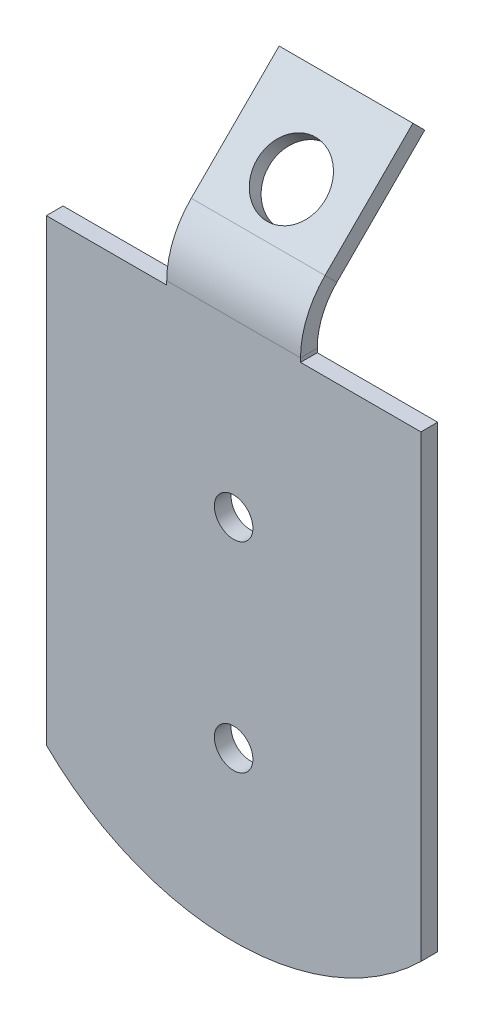
ISO-10303-21;
HEADER;
FILE_DESCRIPTION(('STEP AP214'),'2;1');
FILE_NAME('part.step','',(''),(''),'','','');
FILE_SCHEMA(('AUTOMOTIVE_DESIGN { 1 0 10303 214 1 1 1 1 }'));
ENDSEC;
DATA;
#1=APPLICATION_CONTEXT('core data for automotive mechanical design processes');
#2=APPLICATION_PROTOCOL_DEFINITION('international standard','automotive_design',2000,#1);
#3=PRODUCT_CONTEXT('',#1,'mechanical');
#4=PRODUCT('Part','Part','',(#3));
#5=PRODUCT_RELATED_PRODUCT_CATEGORY('part','',(#4));
#6=PRODUCT_DEFINITION_FORMATION('','',#4);
#7=PRODUCT_DEFINITION_CONTEXT('part definition',#1,'design');
#8=PRODUCT_DEFINITION('design','',#6,#7);
#9=PRODUCT_DEFINITION_SHAPE('','',#8);
#10=(LENGTH_UNIT() NAMED_UNIT(*) SI_UNIT(.MILLI.,.METRE.));
#11=(NAMED_UNIT(*) PLANE_ANGLE_UNIT() SI_UNIT($,.RADIAN.));
#12=(NAMED_UNIT(*) SI_UNIT($,.STERADIAN.) SOLID_ANGLE_UNIT());
#13=UNCERTAINTY_MEASURE_WITH_UNIT(LENGTH_MEASURE(1.E-05),#10,'distance_accuracy_value','');
#14=(GEOMETRIC_REPRESENTATION_CONTEXT(3) GLOBAL_UNCERTAINTY_ASSIGNED_CONTEXT((#13)) GLOBAL_UNIT_ASSIGNED_CONTEXT((#10,
#11,#12)) REPRESENTATION_CONTEXT('',''));
#15=CARTESIAN_POINT('',(0.,0.,0.));
#16=DIRECTION('',(0.,0.,1.));
#17=DIRECTION('',(1.,0.,0.));
#18=AXIS2_PLACEMENT_3D('',#15,#16,#17);
#19=CARTESIAN_POINT('',(0.,0.,1.5875));
#20=DIRECTION('',(0.,0.,-1.));
#21=DIRECTION('',(-1.,0.,0.));
#22=AXIS2_PLACEMENT_3D('',#19,#20,#21);
#23=PLANE('',#22);
#24=CARTESIAN_POINT('',(0.,9.50000000047002,1.5875));
#25=DIRECTION('',(0.,0.,-1.));
#26=DIRECTION('',(-1.,0.,0.));
#27=AXIS2_PLACEMENT_3D('',#24,#25,#26);
#28=CIRCLE('',#27,1.82879999999999);
#29=CARTESIAN_POINT('',(-1.82879999999998,9.50000000047002,1.5875));
#30=VERTEX_POINT('',#29);
#31=EDGE_CURVE('E316',#30,#30,#28,.T.);
#32=ORIENTED_EDGE('',*,*,#31,.T.);
#33=EDGE_LOOP('',(#32));
#34=FACE_BOUND('',#33,.T.);
#35=CARTESIAN_POINT('',(0.,-9.50000000046997,1.5875));
#36=DIRECTION('',(0.,0.,-1.));
#37=DIRECTION('',(-1.,0.,0.));
#38=AXIS2_PLACEMENT_3D('',#35,#36,#37);
#39=CIRCLE('',#38,1.82879999999999);
#40=CARTESIAN_POINT('',(-1.82879999999998,-9.50000000046997,1.5875));
#41=VERTEX_POINT('',#40);
#42=EDGE_CURVE('E313',#41,#41,#39,.T.);
#43=ORIENTED_EDGE('',*,*,#42,.T.);
#44=EDGE_LOOP('',(#43));
#45=FACE_BOUND('',#44,.T.);
#46=CARTESIAN_POINT('',(0.,0.,1.5875));
#47=DIRECTION('',(0.,0.,-1.));
#48=DIRECTION('',(-1.,0.,0.));
#49=AXIS2_PLACEMENT_3D('',#46,#47,#48);
#50=CIRCLE('',#49,25.4);
#51=CARTESIAN_POINT('',(17.78,-18.1392282084988,1.5875));
#52=VERTEX_POINT('',#51);
#53=CARTESIAN_POINT('',(-17.78,-18.1392282084988,1.5875));
#54=VERTEX_POINT('',#53);
#55=EDGE_CURVE('E181',#52,#54,#50,.T.);
#56=ORIENTED_EDGE('',*,*,#55,.F.);
#57=DIRECTION('',(0.,1.,0.));
#58=VECTOR('',#57,1.);
#59=CARTESIAN_POINT('',(17.78,-25.4,1.5875));
#60=LINE('',#59,#58);
#61=CARTESIAN_POINT('',(17.78,25.4,1.5875));
#62=VERTEX_POINT('',#61);
#63=EDGE_CURVE('E188',#52,#62,#60,.T.);
#64=ORIENTED_EDGE('',*,*,#63,.T.);
#65=DIRECTION('',(-1.,0.,0.));
#66=VECTOR('',#65,1.);
#67=CARTESIAN_POINT('',(6.35,25.4,1.5875));
#68=LINE('',#67,#66);
#69=CARTESIAN_POINT('',(6.35,25.4,1.5875));
#70=VERTEX_POINT('',#69);
#71=EDGE_CURVE('E323',#62,#70,#68,.T.);
#72=ORIENTED_EDGE('',*,*,#71,.T.);
#73=DIRECTION('',(0.,1.,0.));
#74=VECTOR('',#73,1.);
#75=CARTESIAN_POINT('',(6.35,25.4,1.5875));
#76=LINE('',#75,#74);
#77=CARTESIAN_POINT('',(6.35,25.7696559351147,1.5875));
#78=VERTEX_POINT('',#77);
#79=EDGE_CURVE('E320',#70,#78,#76,.T.);
#80=ORIENTED_EDGE('',*,*,#79,.T.);
#81=DIRECTION('',(1.,0.,0.));
#82=VECTOR('',#81,1.);
#83=CARTESIAN_POINT('',(0.,25.7696559351147,1.5875));
#84=LINE('',#83,#82);
#85=CARTESIAN_POINT('',(-6.35,25.7696559351147,1.5875));
#86=VERTEX_POINT('',#85);
#87=EDGE_CURVE('E216',#86,#78,#84,.T.);
#88=ORIENTED_EDGE('',*,*,#87,.F.);
#89=DIRECTION('',(0.,-1.,0.));
#90=VECTOR('',#89,1.);
#91=CARTESIAN_POINT('',(-6.35,25.4,1.5875));
#92=LINE('',#91,#90);
#93=CARTESIAN_POINT('',(-6.35,25.4,1.5875));
#94=VERTEX_POINT('',#93);
#95=EDGE_CURVE('E336',#86,#94,#92,.T.);
#96=ORIENTED_EDGE('',*,*,#95,.T.);
#97=DIRECTION('',(-1.,0.,0.));
#98=VECTOR('',#97,1.);
#99=CARTESIAN_POINT('',(-17.78,25.4,1.5875));
#100=LINE('',#99,#98);
#101=CARTESIAN_POINT('',(-17.78,25.4,1.5875));
#102=VERTEX_POINT('',#101);
#103=EDGE_CURVE('E332',#94,#102,#100,.T.);
#104=ORIENTED_EDGE('',*,*,#103,.T.);
#105=DIRECTION('',(0.,-1.,0.));
#106=VECTOR('',#105,1.);
#107=CARTESIAN_POINT('',(-17.78,-25.4,1.5875));
#108=LINE('',#107,#106);
#109=EDGE_CURVE('E328',#102,#54,#108,.T.);
#110=ORIENTED_EDGE('',*,*,#109,.T.);
#111=EDGE_LOOP('',(#56,#64,#72,#80,#88,#96,#104,#110));
#112=FACE_BOUND('',#111,.T.);
#113=ADVANCED_FACE('F61',(#34,#45,#112),#23,.F.);
#114=CARTESIAN_POINT('',(0.,0.,0.));
#115=DIRECTION('',(0.,0.,-1.));
#116=DIRECTION('',(-1.,0.,0.));
#117=AXIS2_PLACEMENT_3D('',#114,#115,#116);
#118=PLANE('',#117);
#119=CARTESIAN_POINT('',(0.,9.50000000047002,0.));
#120=DIRECTION('',(0.,0.,-1.));
#121=DIRECTION('',(-1.,0.,0.));
#122=AXIS2_PLACEMENT_3D('',#119,#120,#121);
#123=CIRCLE('',#122,1.82879999999999);
#124=CARTESIAN_POINT('',(-1.82879999999999,9.50000000047002,0.));
#125=VERTEX_POINT('',#124);
#126=EDGE_CURVE('E209',#125,#125,#123,.T.);
#127=ORIENTED_EDGE('',*,*,#126,.F.);
#128=EDGE_LOOP('',(#127));
#129=FACE_BOUND('',#128,.T.);
#130=CARTESIAN_POINT('',(0.,-9.50000000046997,0.));
#131=DIRECTION('',(0.,0.,-1.));
#132=DIRECTION('',(-1.,0.,0.));
#133=AXIS2_PLACEMENT_3D('',#130,#131,#132);
#134=CIRCLE('',#133,1.82879999999999);
#135=CARTESIAN_POINT('',(-1.82879999999998,-9.50000000046997,0.));
#136=VERTEX_POINT('',#135);
#137=EDGE_CURVE('E213',#136,#136,#134,.T.);
#138=ORIENTED_EDGE('',*,*,#137,.F.);
#139=EDGE_LOOP('',(#138));
#140=FACE_BOUND('',#139,.T.);
#141=DIRECTION('',(0.,1.,0.));
#142=VECTOR('',#141,1.);
#143=CARTESIAN_POINT('',(17.78,0.,0.));
#144=LINE('',#143,#142);
#145=CARTESIAN_POINT('',(17.78,-18.1392282084988,0.));
#146=VERTEX_POINT('',#145);
#147=CARTESIAN_POINT('',(17.78,25.4,0.));
#148=VERTEX_POINT('',#147);
#149=EDGE_CURVE('E186',#146,#148,#144,.T.);
#150=ORIENTED_EDGE('',*,*,#149,.F.);
#151=CARTESIAN_POINT('',(0.,0.,0.));
#152=DIRECTION('',(0.,0.,-1.));
#153=DIRECTION('',(-1.,0.,0.));
#154=AXIS2_PLACEMENT_3D('',#151,#152,#153);
#155=CIRCLE('',#154,25.4);
#156=CARTESIAN_POINT('',(-17.78,-18.1392282084988,0.));
#157=VERTEX_POINT('',#156);
#158=EDGE_CURVE('E172',#146,#157,#155,.T.);
#159=ORIENTED_EDGE('',*,*,#158,.T.);
#160=DIRECTION('',(0.,1.,0.));
#161=VECTOR('',#160,1.);
#162=CARTESIAN_POINT('',(-17.78,0.,0.));
#163=LINE('',#162,#161);
#164=CARTESIAN_POINT('',(-17.78,25.4,0.));
#165=VERTEX_POINT('',#164);
#166=EDGE_CURVE('E201',#165,#157,#163,.F.);
#167=ORIENTED_EDGE('',*,*,#166,.F.);
#168=DIRECTION('',(-1.,0.,0.));
#169=VECTOR('',#168,1.);
#170=CARTESIAN_POINT('',(0.,25.4,0.));
#171=LINE('',#170,#169);
#172=CARTESIAN_POINT('',(-6.35,25.4,0.));
#173=VERTEX_POINT('',#172);
#174=EDGE_CURVE('E342',#173,#165,#171,.T.);
#175=ORIENTED_EDGE('',*,*,#174,.F.);
#176=DIRECTION('',(0.,1.,0.));
#177=VECTOR('',#176,1.);
#178=CARTESIAN_POINT('',(-6.35,0.,0.));
#179=LINE('',#178,#177);
#180=CARTESIAN_POINT('',(-6.35,25.7696559351147,0.));
#181=VERTEX_POINT('',#180);
#182=EDGE_CURVE('E308',#181,#173,#179,.F.);
#183=ORIENTED_EDGE('',*,*,#182,.F.);
#184=DIRECTION('',(1.,0.,0.));
#185=VECTOR('',#184,1.);
#186=CARTESIAN_POINT('',(0.,25.7696559351147,0.));
#187=LINE('',#186,#185);
#188=CARTESIAN_POINT('',(6.35,25.7696559351147,0.));
#189=VERTEX_POINT('',#188);
#190=EDGE_CURVE('E300',#181,#189,#187,.T.);
#191=ORIENTED_EDGE('',*,*,#190,.T.);
#192=DIRECTION('',(0.,1.,0.));
#193=VECTOR('',#192,1.);
#194=CARTESIAN_POINT('',(6.35,0.,0.));
#195=LINE('',#194,#193);
#196=CARTESIAN_POINT('',(6.35,25.4,0.));
#197=VERTEX_POINT('',#196);
#198=EDGE_CURVE('E296',#197,#189,#195,.T.);
#199=ORIENTED_EDGE('',*,*,#198,.F.);
#200=DIRECTION('',(-1.,0.,0.));
#201=VECTOR('',#200,1.);
#202=CARTESIAN_POINT('',(0.,25.4,0.));
#203=LINE('',#202,#201);
#204=EDGE_CURVE('E194',#148,#197,#203,.T.);
#205=ORIENTED_EDGE('',*,*,#204,.F.);
#206=EDGE_LOOP('',(#150,#159,#167,#175,#183,#191,#199,#205));
#207=FACE_BOUND('',#206,.T.);
#208=ADVANCED_FACE('F191',(#129,#140,#207),#118,.T.);
#209=CARTESIAN_POINT('',(17.78,-25.4,1.5875));
#210=DIRECTION('',(-1.,0.,0.));
#211=DIRECTION('',(0.,1.,0.));
#212=AXIS2_PLACEMENT_3D('',#209,#210,#211);
#213=PLANE('',#212);
#214=ORIENTED_EDGE('',*,*,#63,.F.);
#215=DIRECTION('',(0.,0.,-1.));
#216=VECTOR('',#215,1.);
#217=CARTESIAN_POINT('',(17.78,-18.1392282084988,0.));
#218=LINE('',#217,#216);
#219=EDGE_CURVE('E175',#146,#52,#218,.F.);
#220=ORIENTED_EDGE('',*,*,#219,.F.);
#221=ORIENTED_EDGE('',*,*,#149,.T.);
#222=DIRECTION('',(0.,0.,1.));
#223=VECTOR('',#222,1.);
#224=CARTESIAN_POINT('',(17.78,25.4,1.5875));
#225=LINE('',#224,#223);
#226=EDGE_CURVE('E196',#148,#62,#225,.T.);
#227=ORIENTED_EDGE('',*,*,#226,.T.);
#228=EDGE_LOOP('',(#214,#220,#221,#227));
#229=FACE_BOUND('',#228,.T.);
#230=ADVANCED_FACE('F184',(#229),#213,.F.);
#231=CARTESIAN_POINT('',(-17.78,-25.4,1.5875));
#232=DIRECTION('',(1.,0.,0.));
#233=DIRECTION('',(0.,-1.,0.));
#234=AXIS2_PLACEMENT_3D('',#231,#232,#233);
#235=PLANE('',#234);
#236=ORIENTED_EDGE('',*,*,#166,.T.);
#237=DIRECTION('',(0.,0.,-1.));
#238=VECTOR('',#237,1.);
#239=CARTESIAN_POINT('',(-17.78,-18.1392282084988,0.));
#240=LINE('',#239,#238);
#241=EDGE_CURVE('E79',#157,#54,#240,.F.);
#242=ORIENTED_EDGE('',*,*,#241,.T.);
#243=ORIENTED_EDGE('',*,*,#109,.F.);
#244=DIRECTION('',(0.,0.,1.));
#245=VECTOR('',#244,1.);
#246=CARTESIAN_POINT('',(-17.78,25.4,1.5875));
#247=LINE('',#246,#245);
#248=EDGE_CURVE('E339',#165,#102,#247,.T.);
#249=ORIENTED_EDGE('',*,*,#248,.F.);
#250=EDGE_LOOP('',(#236,#242,#243,#249));
#251=FACE_BOUND('',#250,.T.);
#252=ADVANCED_FACE('F347',(#251),#235,.F.);
#253=CARTESIAN_POINT('',(0.,9.1930619265356,21.4519141599156));
#254=DIRECTION('',(0.,-0.707106781186549,-0.707106781186546));
#255=DIRECTION('',(-1.,0.,0.));
#256=AXIS2_PLACEMENT_3D('',#253,#254,#255);
#257=PLANE('',#256);
#258=CARTESIAN_POINT('',(-1.48273577192642E-13,34.5368678978859,-3.89189181143468));
#259=DIRECTION('',(0.,0.707106781186549,0.707106781186546));
#260=DIRECTION('',(0.,-0.707106781186546,0.707106781186549));
#261=AXIS2_PLACEMENT_3D('',#258,#259,#260);
#262=CIRCLE('',#261,3.26389999999999);
#263=CARTESIAN_POINT('',(-1.48273577192642E-13,32.2289420747711,-1.58396598831991));
#264=VERTEX_POINT('',#263);
#265=EDGE_CURVE('E371',#264,#264,#262,.T.);
#266=ORIENTED_EDGE('',*,*,#265,.F.);
#267=EDGE_LOOP('',(#266));
#268=FACE_BOUND('',#267,.T.);
#269=DIRECTION('',(0.,-0.707106781186546,0.707106781186549));
#270=VECTOR('',#269,1.);
#271=CARTESIAN_POINT('',(-6.35,27.1535741686739,3.49140191777731));
#272=LINE('',#271,#270);
#273=CARTESIAN_POINT('',(-6.35,39.7259327381707,-9.08095665171953));
#274=VERTEX_POINT('',#273);
#275=CARTESIAN_POINT('',(-6.35,31.382316010783,-0.737339924331788));
#276=VERTEX_POINT('',#275);
#277=EDGE_CURVE('E230',#274,#276,#272,.T.);
#278=ORIENTED_EDGE('',*,*,#277,.T.);
#279=DIRECTION('',(1.,0.,0.));
#280=VECTOR('',#279,1.);
#281=CARTESIAN_POINT('',(0.,31.382316010783,-0.737339924331788));
#282=LINE('',#281,#280);
#283=CARTESIAN_POINT('',(6.35,31.382316010783,-0.737339924331786));
#284=VERTEX_POINT('',#283);
#285=EDGE_CURVE('E237',#276,#284,#282,.T.);
#286=ORIENTED_EDGE('',*,*,#285,.T.);
#287=DIRECTION('',(0.,0.707106781186546,-0.707106781186549));
#288=VECTOR('',#287,1.);
#289=CARTESIAN_POINT('',(6.35,27.1535741686739,3.49140191777731));
#290=LINE('',#289,#288);
#291=CARTESIAN_POINT('',(6.35,39.7259327381707,-9.08095665171953));
#292=VERTEX_POINT('',#291);
#293=EDGE_CURVE('E225',#284,#292,#290,.T.);
#294=ORIENTED_EDGE('',*,*,#293,.T.);
#295=DIRECTION('',(-1.,0.,0.));
#296=VECTOR('',#295,1.);
#297=CARTESIAN_POINT('',(-6.35,39.7259327381707,-9.08095665171953));
#298=LINE('',#297,#296);
#299=EDGE_CURVE('E220',#292,#274,#298,.T.);
#300=ORIENTED_EDGE('',*,*,#299,.T.);
#301=EDGE_LOOP('',(#278,#286,#294,#300));
#302=FACE_BOUND('',#301,.T.);
#303=ADVANCED_FACE('F259',(#268,#302),#257,.F.);
#304=CARTESIAN_POINT('',(6.35,27.1535741686739,3.49140191777731));
#305=DIRECTION('',(-1.,0.,0.));
#306=DIRECTION('',(0.,0.707106781186546,-0.707106781186549));
#307=AXIS2_PLACEMENT_3D('',#304,#305,#306);
#308=PLANE('',#307);
#309=DIRECTION('',(0.,0.707106781186544,0.707106781186551));
#310=VECTOR('',#309,1.);
#311=CARTESIAN_POINT('',(6.35,31.382316010783,-0.73733992433176));
#312=LINE('',#311,#310);
#313=CARTESIAN_POINT('',(6.35,30.2597839956493,-1.85987193946544));
#314=VERTEX_POINT('',#313);
#315=EDGE_CURVE('E12',#314,#284,#312,.T.);
#316=ORIENTED_EDGE('',*,*,#315,.F.);
#317=DIRECTION('',(0.,0.707106781186546,-0.707106781186549));
#318=VECTOR('',#317,1.);
#319=CARTESIAN_POINT('',(6.35,8.07052991140195,20.329382144782));
#320=LINE('',#319,#318);
#321=CARTESIAN_POINT('',(6.35,38.603400723037,-10.2034886668532));
#322=VERTEX_POINT('',#321);
#323=EDGE_CURVE('E90',#314,#322,#320,.T.);
#324=ORIENTED_EDGE('',*,*,#323,.T.);
#325=DIRECTION('',(0.,0.707106781186549,0.707106781186546));
#326=VECTOR('',#325,1.);
#327=CARTESIAN_POINT('',(6.35,39.7259327381707,-9.08095665171953));
#328=LINE('',#327,#326);
#329=EDGE_CURVE('E233',#322,#292,#328,.T.);
#330=ORIENTED_EDGE('',*,*,#329,.T.);
#331=ORIENTED_EDGE('',*,*,#293,.F.);
#332=EDGE_LOOP('',(#316,#324,#330,#331));
#333=FACE_BOUND('',#332,.T.);
#334=ADVANCED_FACE('F63',(#333),#308,.F.);
#335=CARTESIAN_POINT('',(-6.35,39.7259327381707,-9.08095665171953));
#336=DIRECTION('',(0.,-0.707106781186546,0.707106781186549));
#337=DIRECTION('',(-1.,0.,0.));
#338=AXIS2_PLACEMENT_3D('',#335,#336,#337);
#339=PLANE('',#338);
#340=ORIENTED_EDGE('',*,*,#329,.F.);
#341=DIRECTION('',(-1.,0.,0.));
#342=VECTOR('',#341,1.);
#343=CARTESIAN_POINT('',(0.,38.603400723037,-10.2034886668532));
#344=LINE('',#343,#342);
#345=CARTESIAN_POINT('',(-6.35,38.603400723037,-10.2034886668532));
#346=VERTEX_POINT('',#345);
#347=EDGE_CURVE('E226',#322,#346,#344,.T.);
#348=ORIENTED_EDGE('',*,*,#347,.T.);
#349=DIRECTION('',(0.,0.707106781186549,0.707106781186546));
#350=VECTOR('',#349,1.);
#351=CARTESIAN_POINT('',(-6.35,39.7259327381707,-9.08095665171953));
#352=LINE('',#351,#350);
#353=EDGE_CURVE('E224',#346,#274,#352,.T.);
#354=ORIENTED_EDGE('',*,*,#353,.T.);
#355=ORIENTED_EDGE('',*,*,#299,.F.);
#356=EDGE_LOOP('',(#340,#348,#354,#355));
#357=FACE_BOUND('',#356,.T.);
#358=ADVANCED_FACE('F387',(#357),#339,.F.);
#359=CARTESIAN_POINT('',(-6.35,27.1535741686739,3.49140191777731));
#360=DIRECTION('',(1.,0.,0.));
#361=DIRECTION('',(0.,-0.707106781186546,0.707106781186549));
#362=AXIS2_PLACEMENT_3D('',#359,#360,#361);
#363=PLANE('',#362);
#364=DIRECTION('',(0.,-0.707106781186544,-0.707106781186551));
#365=VECTOR('',#364,1.);
#366=CARTESIAN_POINT('',(-6.35,31.382316010783,-0.73733992433176));
#367=LINE('',#366,#365);
#368=CARTESIAN_POINT('',(-6.35,30.2597839956493,-1.85987193946544));
#369=VERTEX_POINT('',#368);
#370=EDGE_CURVE('E241',#276,#369,#367,.T.);
#371=ORIENTED_EDGE('',*,*,#370,.F.);
#372=ORIENTED_EDGE('',*,*,#277,.F.);
#373=ORIENTED_EDGE('',*,*,#353,.F.);
#374=DIRECTION('',(0.,0.707106781186546,-0.707106781186549));
#375=VECTOR('',#374,1.);
#376=CARTESIAN_POINT('',(-6.35,8.07052991140195,20.329382144782));
#377=LINE('',#376,#375);
#378=EDGE_CURVE('E250',#346,#369,#377,.F.);
#379=ORIENTED_EDGE('',*,*,#378,.T.);
#380=EDGE_LOOP('',(#371,#372,#373,#379));
#381=FACE_BOUND('',#380,.T.);
#382=ADVANCED_FACE('F264',(#381),#363,.F.);
#383=CARTESIAN_POINT('',(0.,8.07052991140195,20.329382144782));
#384=DIRECTION('',(0.,-0.707106781186549,-0.707106781186546));
#385=DIRECTION('',(-1.,0.,0.));
#386=AXIS2_PLACEMENT_3D('',#383,#384,#385);
#387=PLANE('',#386);
#388=CARTESIAN_POINT('',(-1.48273577192642E-13,33.4143358827522,-5.01442382656833));
#389=DIRECTION('',(0.,-0.707106781186549,-0.707106781186546));
#390=DIRECTION('',(0.,0.707106781186546,-0.707106781186549));
#391=AXIS2_PLACEMENT_3D('',#388,#389,#390);
#392=CIRCLE('',#391,3.26389999999999);
#393=CARTESIAN_POINT('',(-1.48273577192642E-13,35.722261705867,-7.3223496496831));
#394=VERTEX_POINT('',#393);
#395=EDGE_CURVE('E65',#394,#394,#392,.T.);
#396=ORIENTED_EDGE('',*,*,#395,.F.);
#397=EDGE_LOOP('',(#396));
#398=FACE_BOUND('',#397,.T.);
#399=DIRECTION('',(1.,0.,0.));
#400=VECTOR('',#399,1.);
#401=CARTESIAN_POINT('',(0.,30.2597839956493,-1.85987193946544));
#402=LINE('',#401,#400);
#403=EDGE_CURVE('E71',#369,#314,#402,.T.);
#404=ORIENTED_EDGE('',*,*,#403,.F.);
#405=ORIENTED_EDGE('',*,*,#378,.F.);
#406=ORIENTED_EDGE('',*,*,#347,.F.);
#407=ORIENTED_EDGE('',*,*,#323,.F.);
#408=EDGE_LOOP('',(#404,#405,#406,#407));
#409=FACE_BOUND('',#408,.T.);
#410=ADVANCED_FACE('F382',(#398,#409),#387,.T.);
#411=CARTESIAN_POINT('',(0.,-9.50000000046997,0.));
#412=DIRECTION('',(0.,0.,-1.));
#413=DIRECTION('',(-1.,0.,0.));
#414=AXIS2_PLACEMENT_3D('',#411,#412,#413);
#415=CYLINDRICAL_SURFACE('',#414,1.82879999999999);
#416=ORIENTED_EDGE('',*,*,#137,.T.);
#417=EDGE_LOOP('',(#416));
#418=FACE_BOUND('',#417,.T.);
#419=ORIENTED_EDGE('',*,*,#42,.F.);
#420=EDGE_LOOP('',(#419));
#421=FACE_BOUND('',#420,.T.);
#422=ADVANCED_FACE('F384',(#418,#421),#415,.F.);
#423=CARTESIAN_POINT('',(0.,9.50000000047002,0.));
#424=DIRECTION('',(0.,0.,-1.));
#425=DIRECTION('',(-1.,0.,0.));
#426=AXIS2_PLACEMENT_3D('',#423,#424,#425);
#427=CYLINDRICAL_SURFACE('',#426,1.82879999999999);
#428=ORIENTED_EDGE('',*,*,#126,.T.);
#429=EDGE_LOOP('',(#428));
#430=FACE_BOUND('',#429,.T.);
#431=ORIENTED_EDGE('',*,*,#31,.F.);
#432=EDGE_LOOP('',(#431));
#433=FACE_BOUND('',#432,.T.);
#434=ADVANCED_FACE('F438',(#430,#433),#427,.F.);
#435=CARTESIAN_POINT('',(6.35,25.4,1.5875));
#436=DIRECTION('',(0.,-1.,0.));
#437=DIRECTION('',(-1.,0.,0.));
#438=AXIS2_PLACEMENT_3D('',#435,#436,#437);
#439=PLANE('',#438);
#440=ORIENTED_EDGE('',*,*,#226,.F.);
#441=ORIENTED_EDGE('',*,*,#204,.T.);
#442=DIRECTION('',(0.,0.,1.));
#443=VECTOR('',#442,1.);
#444=CARTESIAN_POINT('',(6.35,25.4,1.5875));
#445=LINE('',#444,#443);
#446=EDGE_CURVE('E197',#197,#70,#445,.T.);
#447=ORIENTED_EDGE('',*,*,#446,.T.);
#448=ORIENTED_EDGE('',*,*,#71,.F.);
#449=EDGE_LOOP('',(#440,#441,#447,#448));
#450=FACE_BOUND('',#449,.T.);
#451=ADVANCED_FACE('F367',(#450),#439,.F.);
#452=CARTESIAN_POINT('',(-17.78,25.4,1.5875));
#453=DIRECTION('',(0.,-1.,0.));
#454=DIRECTION('',(-1.,0.,0.));
#455=AXIS2_PLACEMENT_3D('',#452,#453,#454);
#456=PLANE('',#455);
#457=ORIENTED_EDGE('',*,*,#174,.T.);
#458=ORIENTED_EDGE('',*,*,#248,.T.);
#459=ORIENTED_EDGE('',*,*,#103,.F.);
#460=DIRECTION('',(0.,0.,1.));
#461=VECTOR('',#460,1.);
#462=CARTESIAN_POINT('',(-6.35,25.4,1.5875));
#463=LINE('',#462,#461);
#464=EDGE_CURVE('E304',#173,#94,#463,.T.);
#465=ORIENTED_EDGE('',*,*,#464,.F.);
#466=EDGE_LOOP('',(#457,#458,#459,#465));
#467=FACE_BOUND('',#466,.T.);
#468=ADVANCED_FACE('F353',(#467),#456,.F.);
#469=CARTESIAN_POINT('',(-6.35,25.4,1.5875));
#470=DIRECTION('',(1.,0.,0.));
#471=DIRECTION('',(0.,-1.,0.));
#472=AXIS2_PLACEMENT_3D('',#469,#470,#471);
#473=PLANE('',#472);
#474=ORIENTED_EDGE('',*,*,#95,.F.);
#475=DIRECTION('',(0.,0.,-1.));
#476=VECTOR('',#475,1.);
#477=CARTESIAN_POINT('',(-6.35,25.7696559351147,1.5875));
#478=LINE('',#477,#476);
#479=EDGE_CURVE('E272',#86,#181,#478,.T.);
#480=ORIENTED_EDGE('',*,*,#479,.T.);
#481=ORIENTED_EDGE('',*,*,#182,.T.);
#482=ORIENTED_EDGE('',*,*,#464,.T.);
#483=EDGE_LOOP('',(#474,#480,#481,#482));
#484=FACE_BOUND('',#483,.T.);
#485=ADVANCED_FACE('F357',(#484),#473,.F.);
#486=CARTESIAN_POINT('',(6.35,25.4,1.5875));
#487=DIRECTION('',(-1.,0.,0.));
#488=DIRECTION('',(0.,1.,0.));
#489=AXIS2_PLACEMENT_3D('',#486,#487,#488);
#490=PLANE('',#489);
#491=ORIENTED_EDGE('',*,*,#198,.T.);
#492=DIRECTION('',(0.,0.,1.));
#493=VECTOR('',#492,1.);
#494=CARTESIAN_POINT('',(6.35,25.7696559351147,1.5875));
#495=LINE('',#494,#493);
#496=EDGE_CURVE('E253',#189,#78,#495,.T.);
#497=ORIENTED_EDGE('',*,*,#496,.T.);
#498=ORIENTED_EDGE('',*,*,#79,.F.);
#499=ORIENTED_EDGE('',*,*,#446,.F.);
#500=EDGE_LOOP('',(#491,#497,#498,#499));
#501=FACE_BOUND('',#500,.T.);
#502=ADVANCED_FACE('F363',(#501),#490,.F.);
#503=CARTESIAN_POINT('',(-6.35,25.7696559351147,-6.35));
#504=DIRECTION('',(-1.,0.,0.));
#505=DIRECTION('',(0.,0.,1.));
#506=AXIS2_PLACEMENT_3D('',#503,#504,#505);
#507=PLANE('',#506);
#508=ORIENTED_EDGE('',*,*,#370,.T.);
#509=CARTESIAN_POINT('',(-6.35,25.7696559351147,-6.35));
#510=DIRECTION('',(-1.,0.,0.));
#511=DIRECTION('',(0.,0.,1.));
#512=AXIS2_PLACEMENT_3D('',#509,#510,#511);
#513=CIRCLE('',#512,6.35);
#514=EDGE_CURVE('E290',#369,#181,#513,.F.);
#515=ORIENTED_EDGE('',*,*,#514,.T.);
#516=ORIENTED_EDGE('',*,*,#479,.F.);
#517=CARTESIAN_POINT('',(-6.35,25.7696559351147,-6.35));
#518=DIRECTION('',(1.,0.,0.));
#519=DIRECTION('',(0.,0.,-1.));
#520=AXIS2_PLACEMENT_3D('',#517,#518,#519);
#521=CIRCLE('',#520,7.9375);
#522=EDGE_CURVE('E269',#276,#86,#521,.T.);
#523=ORIENTED_EDGE('',*,*,#522,.F.);
#524=EDGE_LOOP('',(#508,#515,#516,#523));
#525=FACE_BOUND('',#524,.T.);
#526=ADVANCED_FACE('F270',(#525),#507,.T.);
#527=CARTESIAN_POINT('',(6.35,25.7696559351147,-6.35));
#528=DIRECTION('',(1.,0.,0.));
#529=DIRECTION('',(0.,0.,-1.));
#530=AXIS2_PLACEMENT_3D('',#527,#528,#529);
#531=PLANE('',#530);
#532=ORIENTED_EDGE('',*,*,#496,.F.);
#533=CARTESIAN_POINT('',(6.35,25.7696559351147,-6.35));
#534=DIRECTION('',(-1.,0.,0.));
#535=DIRECTION('',(0.,0.,1.));
#536=AXIS2_PLACEMENT_3D('',#533,#534,#535);
#537=CIRCLE('',#536,6.35);
#538=EDGE_CURVE('E276',#189,#314,#537,.T.);
#539=ORIENTED_EDGE('',*,*,#538,.T.);
#540=ORIENTED_EDGE('',*,*,#315,.T.);
#541=CARTESIAN_POINT('',(6.35,25.7696559351147,-6.35));
#542=DIRECTION('',(-1.,0.,0.));
#543=DIRECTION('',(0.,0.,1.));
#544=AXIS2_PLACEMENT_3D('',#541,#542,#543);
#545=CIRCLE('',#544,7.9375);
#546=EDGE_CURVE('E219',#78,#284,#545,.T.);
#547=ORIENTED_EDGE('',*,*,#546,.F.);
#548=EDGE_LOOP('',(#532,#539,#540,#547));
#549=FACE_BOUND('',#548,.T.);
#550=ADVANCED_FACE('F389',(#549),#531,.T.);
#551=CARTESIAN_POINT('',(13.974619048101,25.7696559351147,-6.35));
#552=DIRECTION('',(-1.,0.,0.));
#553=DIRECTION('',(0.,0.,1.));
#554=AXIS2_PLACEMENT_3D('',#551,#552,#553);
#555=CYLINDRICAL_SURFACE('',#554,7.9375);
#556=ORIENTED_EDGE('',*,*,#546,.T.);
#557=ORIENTED_EDGE('',*,*,#285,.F.);
#558=ORIENTED_EDGE('',*,*,#522,.T.);
#559=ORIENTED_EDGE('',*,*,#87,.T.);
#560=EDGE_LOOP('',(#556,#557,#558,#559));
#561=FACE_BOUND('',#560,.T.);
#562=ADVANCED_FACE('F279',(#561),#555,.T.);
#563=CARTESIAN_POINT('',(13.974619048101,25.7696559351147,-6.35));
#564=DIRECTION('',(-1.,0.,0.));
#565=DIRECTION('',(0.,0.,1.));
#566=AXIS2_PLACEMENT_3D('',#563,#564,#565);
#567=CYLINDRICAL_SURFACE('',#566,6.35);
#568=ORIENTED_EDGE('',*,*,#538,.F.);
#569=ORIENTED_EDGE('',*,*,#190,.F.);
#570=ORIENTED_EDGE('',*,*,#514,.F.);
#571=ORIENTED_EDGE('',*,*,#403,.T.);
#572=EDGE_LOOP('',(#568,#569,#570,#571));
#573=FACE_BOUND('',#572,.T.);
#574=ADVANCED_FACE('F361',(#573),#567,.F.);
#575=CARTESIAN_POINT('',(0.,0.,0.));
#576=DIRECTION('',(0.,0.,-1.));
#577=DIRECTION('',(-1.,0.,0.));
#578=AXIS2_PLACEMENT_3D('',#575,#576,#577);
#579=CYLINDRICAL_SURFACE('',#578,25.4);
#580=ORIENTED_EDGE('',*,*,#241,.F.);
#581=ORIENTED_EDGE('',*,*,#158,.F.);
#582=ORIENTED_EDGE('',*,*,#219,.T.);
#583=ORIENTED_EDGE('',*,*,#55,.T.);
#584=EDGE_LOOP('',(#580,#581,#582,#583));
#585=FACE_BOUND('',#584,.T.);
#586=ADVANCED_FACE('F174',(#585),#579,.T.);
#587=CARTESIAN_POINT('',(-1.48273577192642E-13,34.5368678978859,-3.89189181143468));
#588=DIRECTION('',(0.,0.707106781186549,0.707106781186546));
#589=DIRECTION('',(0.,-0.707106781186546,0.707106781186549));
#590=AXIS2_PLACEMENT_3D('',#587,#588,#589);
#591=CYLINDRICAL_SURFACE('',#590,3.26389999999999);
#592=ORIENTED_EDGE('',*,*,#395,.T.);
#593=EDGE_LOOP('',(#592));
#594=FACE_BOUND('',#593,.T.);
#595=ORIENTED_EDGE('',*,*,#265,.T.);
#596=EDGE_LOOP('',(#595));
#597=FACE_BOUND('',#596,.T.);
#598=ADVANCED_FACE('F380',(#594,#597),#591,.F.);
#599=CLOSED_SHELL('',(#113,#208,#230,#252,#303,#334,#358,#382,#410,#422,#434,#451,#468,#485,
#502,#526,#550,#562,#574,#586,#598));
#600=MANIFOLD_SOLID_BREP('B2',#599);
#601=ADVANCED_BREP_SHAPE_REPRESENTATION('',(#18,#600),#14);
#602=SHAPE_DEFINITION_REPRESENTATION(#9,#601);
ENDSEC;
END-ISO-10303-21;
